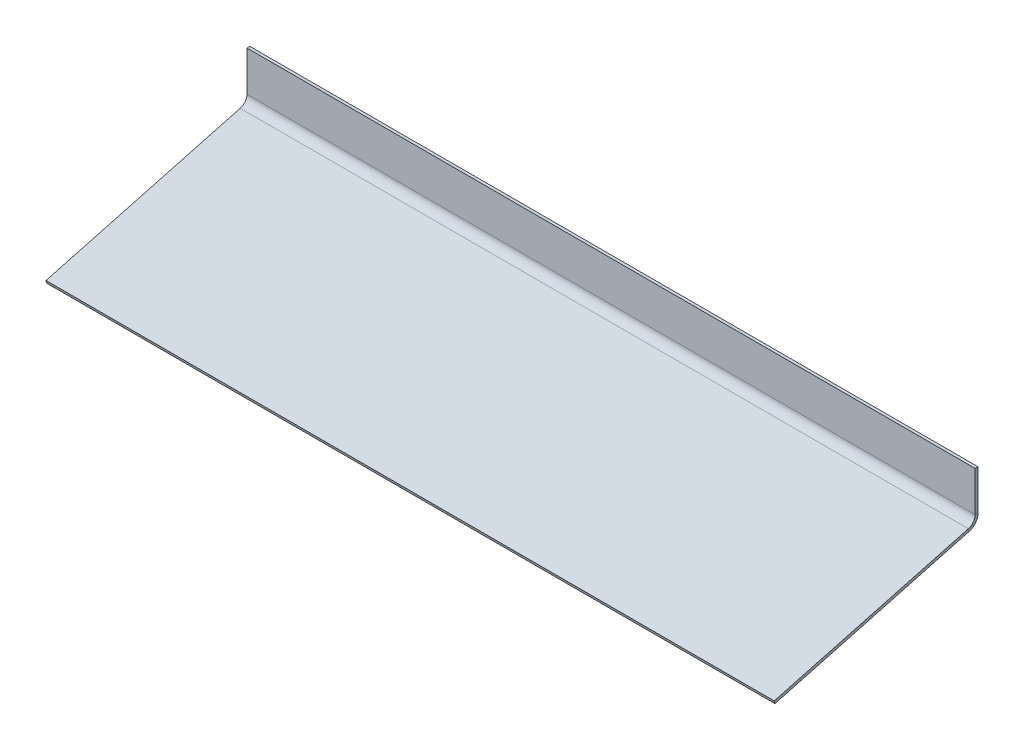
ISO-10303-21;
HEADER;
FILE_DESCRIPTION(('STEP AP214'),'2;1');
FILE_NAME('part.step','',(''),(''),'','','');
FILE_SCHEMA(('AUTOMOTIVE_DESIGN { 1 0 10303 214 1 1 1 1 }'));
ENDSEC;
DATA;
#1=APPLICATION_CONTEXT('core data for automotive mechanical design processes');
#2=APPLICATION_PROTOCOL_DEFINITION('international standard','automotive_design',2000,#1);
#3=PRODUCT_CONTEXT('',#1,'mechanical');
#4=PRODUCT('Part','Part','',(#3));
#5=PRODUCT_RELATED_PRODUCT_CATEGORY('part','',(#4));
#6=PRODUCT_DEFINITION_FORMATION('','',#4);
#7=PRODUCT_DEFINITION_CONTEXT('part definition',#1,'design');
#8=PRODUCT_DEFINITION('design','',#6,#7);
#9=PRODUCT_DEFINITION_SHAPE('','',#8);
#10=(LENGTH_UNIT() NAMED_UNIT(*) SI_UNIT(.MILLI.,.METRE.));
#11=(NAMED_UNIT(*) PLANE_ANGLE_UNIT() SI_UNIT($,.RADIAN.));
#12=(NAMED_UNIT(*) SI_UNIT($,.STERADIAN.) SOLID_ANGLE_UNIT());
#13=UNCERTAINTY_MEASURE_WITH_UNIT(LENGTH_MEASURE(1.E-05),#10,'distance_accuracy_value','');
#14=(GEOMETRIC_REPRESENTATION_CONTEXT(3) GLOBAL_UNCERTAINTY_ASSIGNED_CONTEXT((#13)) GLOBAL_UNIT_ASSIGNED_CONTEXT((#10,
#11,#12)) REPRESENTATION_CONTEXT('',''));
#15=CARTESIAN_POINT('',(0.,0.,0.));
#16=DIRECTION('',(0.,0.,1.));
#17=DIRECTION('',(1.,0.,0.));
#18=AXIS2_PLACEMENT_3D('',#15,#16,#17);
#19=CARTESIAN_POINT('',(203.2,42.9719521339447,56.666738549513));
#20=DIRECTION('',(-1.,0.,0.));
#21=DIRECTION('',(0.,0.258819045102518,-0.965925826289069));
#22=AXIS2_PLACEMENT_3D('',#19,#20,#21);
#23=PLANE('',#22);
#24=DIRECTION('',(0.,0.258819045102518,-0.965925826289069));
#25=VECTOR('',#24,1.);
#26=CARTESIAN_POINT('',(203.2,42.1992105649432,56.459683070141));
#27=LINE('',#26,#25);
#28=CARTESIAN_POINT('',(203.2,42.1992105649432,56.459683070141));
#29=VERTEX_POINT('',#28);
#30=CARTESIAN_POINT('',(203.2,56.7178068322242,2.27554414606768));
#31=VERTEX_POINT('',#30);
#32=EDGE_CURVE('E89',#29,#31,#27,.T.);
#33=ORIENTED_EDGE('',*,*,#32,.T.);
#34=DIRECTION('',(0.,0.965925826289067,0.258819045102525));
#35=VECTOR('',#34,1.);
#36=CARTESIAN_POINT('',(203.2,57.4905484012261,2.4825996254397));
#37=LINE('',#36,#35);
#38=CARTESIAN_POINT('',(203.2,57.4905484012258,2.48259962543961));
#39=VERTEX_POINT('',#38);
#40=EDGE_CURVE('E130',#31,#39,#37,.T.);
#41=ORIENTED_EDGE('',*,*,#40,.T.);
#42=DIRECTION('',(0.,0.258819045102518,-0.965925826289069));
#43=VECTOR('',#42,1.);
#44=CARTESIAN_POINT('',(203.2,42.9719521339447,56.666738549513));
#45=LINE('',#44,#43);
#46=CARTESIAN_POINT('',(203.2,42.9719521339447,56.666738549513));
#47=VERTEX_POINT('',#46);
#48=EDGE_CURVE('E132',#47,#39,#45,.T.);
#49=ORIENTED_EDGE('',*,*,#48,.F.);
#50=DIRECTION('',(0.,0.965925826289069,0.258819045102518));
#51=VECTOR('',#50,1.);
#52=CARTESIAN_POINT('',(203.2,42.9719521339447,56.666738549513));
#53=LINE('',#52,#51);
#54=EDGE_CURVE('E155',#29,#47,#53,.T.);
#55=ORIENTED_EDGE('',*,*,#54,.F.);
#56=EDGE_LOOP('',(#33,#41,#49,#55));
#57=FACE_BOUND('',#56,.T.);
#58=ADVANCED_FACE('F65',(#57),#23,.F.);
#59=CARTESIAN_POINT('',(0.,42.9719521339447,56.666738549513));
#60=DIRECTION('',(1.,0.,0.));
#61=DIRECTION('',(0.,-0.258819045102518,0.965925826289069));
#62=AXIS2_PLACEMENT_3D('',#59,#60,#61);
#63=PLANE('',#62);
#64=DIRECTION('',(0.,-0.258819045102518,0.965925826289069));
#65=VECTOR('',#64,1.);
#66=CARTESIAN_POINT('',(0.,42.9719521339447,56.666738549513));
#67=LINE('',#66,#65);
#68=CARTESIAN_POINT('',(0.,57.4905484012258,2.4825996254396));
#69=VERTEX_POINT('',#68);
#70=CARTESIAN_POINT('',(0.,42.9719521339447,56.666738549513));
#71=VERTEX_POINT('',#70);
#72=EDGE_CURVE('E69',#69,#71,#67,.T.);
#73=ORIENTED_EDGE('',*,*,#72,.F.);
#74=DIRECTION('',(0.,-0.965925826289067,-0.258819045102525));
#75=VECTOR('',#74,1.);
#76=CARTESIAN_POINT('',(0.,57.4905484012261,2.4825996254397));
#77=LINE('',#76,#75);
#78=CARTESIAN_POINT('',(0.,56.7178068322242,2.27554414606768));
#79=VERTEX_POINT('',#78);
#80=EDGE_CURVE('E12',#69,#79,#77,.T.);
#81=ORIENTED_EDGE('',*,*,#80,.T.);
#82=DIRECTION('',(0.,0.258819045102518,-0.965925826289069));
#83=VECTOR('',#82,1.);
#84=CARTESIAN_POINT('',(0.,42.1992105649432,56.459683070141));
#85=LINE('',#84,#83);
#86=CARTESIAN_POINT('',(0.,42.1992105649432,56.459683070141));
#87=VERTEX_POINT('',#86);
#88=EDGE_CURVE('E82',#79,#87,#85,.F.);
#89=ORIENTED_EDGE('',*,*,#88,.T.);
#90=DIRECTION('',(0.,0.965925826289069,0.258819045102518));
#91=VECTOR('',#90,1.);
#92=CARTESIAN_POINT('',(0.,42.9719521339447,56.666738549513));
#93=LINE('',#92,#91);
#94=EDGE_CURVE('E146',#87,#71,#93,.T.);
#95=ORIENTED_EDGE('',*,*,#94,.T.);
#96=EDGE_LOOP('',(#73,#81,#89,#95));
#97=FACE_BOUND('',#96,.T.);
#98=ADVANCED_FACE('F67',(#97),#63,.F.);
#99=CARTESIAN_POINT('',(0.,42.1992105649432,56.459683070141));
#100=DIRECTION('',(0.,-0.965925826289069,-0.258819045102518));
#101=DIRECTION('',(-1.,0.,0.));
#102=AXIS2_PLACEMENT_3D('',#99,#100,#101);
#103=PLANE('',#102);
#104=ORIENTED_EDGE('',*,*,#88,.F.);
#105=DIRECTION('',(1.,0.,0.));
#106=VECTOR('',#105,1.);
#107=CARTESIAN_POINT('',(0.,56.7178068322242,2.27554414606768));
#108=LINE('',#107,#106);
#109=EDGE_CURVE('E74',#79,#31,#108,.T.);
#110=ORIENTED_EDGE('',*,*,#109,.T.);
#111=ORIENTED_EDGE('',*,*,#32,.F.);
#112=DIRECTION('',(-1.,0.,0.));
#113=VECTOR('',#112,1.);
#114=CARTESIAN_POINT('',(0.,42.1992105649432,56.459683070141));
#115=LINE('',#114,#113);
#116=EDGE_CURVE('E199',#87,#29,#115,.F.);
#117=ORIENTED_EDGE('',*,*,#116,.F.);
#118=EDGE_LOOP('',(#104,#110,#111,#117));
#119=FACE_BOUND('',#118,.T.);
#120=ADVANCED_FACE('F212',(#119),#103,.T.);
#121=CARTESIAN_POINT('',(0.,42.9719521339447,56.666738549513));
#122=DIRECTION('',(0.,0.258819045102518,-0.965925826289069));
#123=DIRECTION('',(1.,0.,0.));
#124=AXIS2_PLACEMENT_3D('',#121,#122,#123);
#125=PLANE('',#124);
#126=ORIENTED_EDGE('',*,*,#116,.T.);
#127=ORIENTED_EDGE('',*,*,#54,.T.);
#128=DIRECTION('',(1.,0.,0.));
#129=VECTOR('',#128,1.);
#130=CARTESIAN_POINT('',(0.,42.9719521339447,56.666738549513));
#131=LINE('',#130,#129);
#132=EDGE_CURVE('E145',#71,#47,#131,.T.);
#133=ORIENTED_EDGE('',*,*,#132,.F.);
#134=ORIENTED_EDGE('',*,*,#94,.F.);
#135=EDGE_LOOP('',(#126,#127,#133,#134));
#136=FACE_BOUND('',#135,.T.);
#137=ADVANCED_FACE('F211',(#136),#125,.F.);
#138=CARTESIAN_POINT('',(0.,42.9719521339447,56.666738549513));
#139=DIRECTION('',(0.,-0.965925826289069,-0.258819045102518));
#140=DIRECTION('',(-1.,0.,0.));
#141=AXIS2_PLACEMENT_3D('',#138,#139,#140);
#142=PLANE('',#141);
#143=DIRECTION('',(1.,0.,0.));
#144=VECTOR('',#143,1.);
#145=CARTESIAN_POINT('',(0.,57.4905484012258,2.4825996254396));
#146=LINE('',#145,#144);
#147=EDGE_CURVE('E137',#69,#39,#146,.T.);
#148=ORIENTED_EDGE('',*,*,#147,.F.);
#149=ORIENTED_EDGE('',*,*,#72,.T.);
#150=ORIENTED_EDGE('',*,*,#132,.T.);
#151=ORIENTED_EDGE('',*,*,#48,.T.);
#152=EDGE_LOOP('',(#148,#149,#150,#151));
#153=FACE_BOUND('',#152,.T.);
#154=ADVANCED_FACE('F142',(#153),#142,.F.);
#155=CARTESIAN_POINT('',(0.,71.12,0.6));
#156=DIRECTION('',(0.,-1.,0.));
#157=DIRECTION('',(-1.,0.,0.));
#158=AXIS2_PLACEMENT_3D('',#155,#156,#157);
#159=PLANE('',#158);
#160=DIRECTION('',(0.,0.,1.));
#161=VECTOR('',#160,1.);
#162=CARTESIAN_POINT('',(203.2,71.12,0.6));
#163=LINE('',#162,#161);
#164=CARTESIAN_POINT('',(203.2,71.12,-0.20000094));
#165=VERTEX_POINT('',#164);
#166=CARTESIAN_POINT('',(203.2,71.12,0.6));
#167=VERTEX_POINT('',#166);
#168=EDGE_CURVE('E175',#165,#167,#163,.T.);
#169=ORIENTED_EDGE('',*,*,#168,.F.);
#170=DIRECTION('',(-1.,0.,0.));
#171=VECTOR('',#170,1.);
#172=CARTESIAN_POINT('',(0.,71.12,-0.20000094));
#173=LINE('',#172,#171);
#174=CARTESIAN_POINT('',(0.,71.12,-0.20000094));
#175=VERTEX_POINT('',#174);
#176=EDGE_CURVE('E192',#165,#175,#173,.T.);
#177=ORIENTED_EDGE('',*,*,#176,.T.);
#178=DIRECTION('',(0.,0.,1.));
#179=VECTOR('',#178,1.);
#180=CARTESIAN_POINT('',(0.,71.12,0.6));
#181=LINE('',#180,#179);
#182=CARTESIAN_POINT('',(0.,71.12,0.6));
#183=VERTEX_POINT('',#182);
#184=EDGE_CURVE('E190',#175,#183,#181,.T.);
#185=ORIENTED_EDGE('',*,*,#184,.T.);
#186=DIRECTION('',(-1.,0.,0.));
#187=VECTOR('',#186,1.);
#188=CARTESIAN_POINT('',(0.,71.12,0.6));
#189=LINE('',#188,#187);
#190=EDGE_CURVE('E180',#167,#183,#189,.T.);
#191=ORIENTED_EDGE('',*,*,#190,.F.);
#192=EDGE_LOOP('',(#169,#177,#185,#191));
#193=FACE_BOUND('',#192,.T.);
#194=ADVANCED_FACE('F235',(#193),#159,.F.);
#195=CARTESIAN_POINT('',(0.,0.,0.6));
#196=DIRECTION('',(0.,0.,-1.));
#197=DIRECTION('',(-1.,0.,0.));
#198=AXIS2_PLACEMENT_3D('',#195,#196,#197);
#199=PLANE('',#198);
#200=DIRECTION('',(0.,-1.,0.));
#201=VECTOR('',#200,1.);
#202=CARTESIAN_POINT('',(0.,0.,0.6));
#203=LINE('',#202,#201);
#204=CARTESIAN_POINT('',(0.,59.944,0.6));
#205=VERTEX_POINT('',#204);
#206=EDGE_CURVE('E188',#183,#205,#203,.T.);
#207=ORIENTED_EDGE('',*,*,#206,.T.);
#208=DIRECTION('',(1.,0.,0.));
#209=VECTOR('',#208,1.);
#210=CARTESIAN_POINT('',(0.,59.944,0.6));
#211=LINE('',#210,#209);
#212=CARTESIAN_POINT('',(203.2,59.944,0.600000000000001));
#213=VERTEX_POINT('',#212);
#214=EDGE_CURVE('E185',#205,#213,#211,.T.);
#215=ORIENTED_EDGE('',*,*,#214,.T.);
#216=DIRECTION('',(0.,1.,0.));
#217=VECTOR('',#216,1.);
#218=CARTESIAN_POINT('',(203.2,0.,0.6));
#219=LINE('',#218,#217);
#220=EDGE_CURVE('E183',#213,#167,#219,.T.);
#221=ORIENTED_EDGE('',*,*,#220,.T.);
#222=ORIENTED_EDGE('',*,*,#190,.T.);
#223=EDGE_LOOP('',(#207,#215,#221,#222));
#224=FACE_BOUND('',#223,.T.);
#225=ADVANCED_FACE('F233',(#224),#199,.F.);
#226=CARTESIAN_POINT('',(203.2,0.,0.6));
#227=DIRECTION('',(-1.,0.,0.));
#228=DIRECTION('',(0.,1.,0.));
#229=AXIS2_PLACEMENT_3D('',#226,#227,#228);
#230=PLANE('',#229);
#231=DIRECTION('',(0.,0.,1.));
#232=VECTOR('',#231,1.);
#233=CARTESIAN_POINT('',(203.2,59.944,0.600000000000419));
#234=LINE('',#233,#232);
#235=CARTESIAN_POINT('',(203.2,59.944,-0.20000094));
#236=VERTEX_POINT('',#235);
#237=EDGE_CURVE('E160',#236,#213,#234,.T.);
#238=ORIENTED_EDGE('',*,*,#237,.F.);
#239=DIRECTION('',(0.,1.,0.));
#240=VECTOR('',#239,1.);
#241=CARTESIAN_POINT('',(203.2,0.,-0.20000094));
#242=LINE('',#241,#240);
#243=EDGE_CURVE('E178',#236,#165,#242,.T.);
#244=ORIENTED_EDGE('',*,*,#243,.T.);
#245=ORIENTED_EDGE('',*,*,#168,.T.);
#246=ORIENTED_EDGE('',*,*,#220,.F.);
#247=EDGE_LOOP('',(#238,#244,#245,#246));
#248=FACE_BOUND('',#247,.T.);
#249=ADVANCED_FACE('F230',(#248),#230,.F.);
#250=CARTESIAN_POINT('',(0.,0.,-0.20000094));
#251=DIRECTION('',(0.,0.,-1.));
#252=DIRECTION('',(-1.,0.,0.));
#253=AXIS2_PLACEMENT_3D('',#250,#251,#252);
#254=PLANE('',#253);
#255=DIRECTION('',(1.,0.,0.));
#256=VECTOR('',#255,1.);
#257=CARTESIAN_POINT('',(0.,59.944,-0.20000094));
#258=LINE('',#257,#256);
#259=CARTESIAN_POINT('',(0.,59.944,-0.20000094));
#260=VERTEX_POINT('',#259);
#261=EDGE_CURVE('E164',#260,#236,#258,.T.);
#262=ORIENTED_EDGE('',*,*,#261,.F.);
#263=DIRECTION('',(0.,1.,0.));
#264=VECTOR('',#263,1.);
#265=CARTESIAN_POINT('',(0.,0.,-0.20000094));
#266=LINE('',#265,#264);
#267=EDGE_CURVE('E173',#175,#260,#266,.F.);
#268=ORIENTED_EDGE('',*,*,#267,.F.);
#269=ORIENTED_EDGE('',*,*,#176,.F.);
#270=ORIENTED_EDGE('',*,*,#243,.F.);
#271=EDGE_LOOP('',(#262,#268,#269,#270));
#272=FACE_BOUND('',#271,.T.);
#273=ADVANCED_FACE('F227',(#272),#254,.T.);
#274=CARTESIAN_POINT('',(0.,0.,0.6));
#275=DIRECTION('',(1.,0.,0.));
#276=DIRECTION('',(0.,-1.,0.));
#277=AXIS2_PLACEMENT_3D('',#274,#275,#276);
#278=PLANE('',#277);
#279=DIRECTION('',(0.,0.,-1.));
#280=VECTOR('',#279,1.);
#281=CARTESIAN_POINT('',(0.,59.944,0.600000000000419));
#282=LINE('',#281,#280);
#283=EDGE_CURVE('E161',#205,#260,#282,.T.);
#284=ORIENTED_EDGE('',*,*,#283,.F.);
#285=ORIENTED_EDGE('',*,*,#206,.F.);
#286=ORIENTED_EDGE('',*,*,#184,.F.);
#287=ORIENTED_EDGE('',*,*,#267,.T.);
#288=EDGE_LOOP('',(#284,#285,#286,#287));
#289=FACE_BOUND('',#288,.T.);
#290=ADVANCED_FACE('F222',(#289),#278,.F.);
#291=CARTESIAN_POINT('',(0.,59.944,3.14));
#292=DIRECTION('',(1.,0.,0.));
#293=DIRECTION('',(0.,0.,-1.));
#294=AXIS2_PLACEMENT_3D('',#291,#292,#293);
#295=PLANE('',#294);
#296=ORIENTED_EDGE('',*,*,#283,.T.);
#297=CARTESIAN_POINT('',(0.,59.944,3.14));
#298=DIRECTION('',(1.,0.,0.));
#299=DIRECTION('',(0.,0.,-1.));
#300=AXIS2_PLACEMENT_3D('',#297,#298,#299);
#301=CIRCLE('',#300,3.34000094);
#302=EDGE_CURVE('E170',#260,#79,#301,.F.);
#303=ORIENTED_EDGE('',*,*,#302,.T.);
#304=ORIENTED_EDGE('',*,*,#80,.F.);
#305=CARTESIAN_POINT('',(0.,59.944,3.14));
#306=DIRECTION('',(-1.,0.,0.));
#307=DIRECTION('',(0.,0.,1.));
#308=AXIS2_PLACEMENT_3D('',#305,#306,#307);
#309=CIRCLE('',#308,2.54);
#310=EDGE_CURVE('E154',#205,#69,#309,.T.);
#311=ORIENTED_EDGE('',*,*,#310,.F.);
#312=EDGE_LOOP('',(#296,#303,#304,#311));
#313=FACE_BOUND('',#312,.T.);
#314=ADVANCED_FACE('F218',(#313),#295,.F.);
#315=CARTESIAN_POINT('',(203.2,59.944,3.14));
#316=DIRECTION('',(-1.,0.,0.));
#317=DIRECTION('',(0.,0.,1.));
#318=AXIS2_PLACEMENT_3D('',#315,#316,#317);
#319=PLANE('',#318);
#320=ORIENTED_EDGE('',*,*,#40,.F.);
#321=CARTESIAN_POINT('',(203.2,59.944,3.14));
#322=DIRECTION('',(1.,0.,0.));
#323=DIRECTION('',(0.,0.,-1.));
#324=AXIS2_PLACEMENT_3D('',#321,#322,#323);
#325=CIRCLE('',#324,3.34000094);
#326=EDGE_CURVE('E166',#31,#236,#325,.T.);
#327=ORIENTED_EDGE('',*,*,#326,.T.);
#328=ORIENTED_EDGE('',*,*,#237,.T.);
#329=CARTESIAN_POINT('',(203.2,59.944,3.14));
#330=DIRECTION('',(1.,0.,0.));
#331=DIRECTION('',(0.,0.,-1.));
#332=AXIS2_PLACEMENT_3D('',#329,#330,#331);
#333=CIRCLE('',#332,2.54);
#334=EDGE_CURVE('E152',#39,#213,#333,.T.);
#335=ORIENTED_EDGE('',*,*,#334,.F.);
#336=EDGE_LOOP('',(#320,#327,#328,#335));
#337=FACE_BOUND('',#336,.T.);
#338=ADVANCED_FACE('F158',(#337),#319,.F.);
#339=CARTESIAN_POINT('',(-101.638014606874,59.944,3.14));
#340=DIRECTION('',(1.,0.,0.));
#341=DIRECTION('',(0.,0.,-1.));
#342=AXIS2_PLACEMENT_3D('',#339,#340,#341);
#343=CYLINDRICAL_SURFACE('',#342,2.54);
#344=ORIENTED_EDGE('',*,*,#334,.T.);
#345=ORIENTED_EDGE('',*,*,#214,.F.);
#346=ORIENTED_EDGE('',*,*,#310,.T.);
#347=ORIENTED_EDGE('',*,*,#147,.T.);
#348=EDGE_LOOP('',(#344,#345,#346,#347));
#349=FACE_BOUND('',#348,.T.);
#350=ADVANCED_FACE('F150',(#349),#343,.F.);
#351=CARTESIAN_POINT('',(-101.638014606874,59.944,3.14));
#352=DIRECTION('',(1.,0.,0.));
#353=DIRECTION('',(0.,0.,-1.));
#354=AXIS2_PLACEMENT_3D('',#351,#352,#353);
#355=CYLINDRICAL_SURFACE('',#354,3.34000094);
#356=ORIENTED_EDGE('',*,*,#326,.F.);
#357=ORIENTED_EDGE('',*,*,#109,.F.);
#358=ORIENTED_EDGE('',*,*,#302,.F.);
#359=ORIENTED_EDGE('',*,*,#261,.T.);
#360=EDGE_LOOP('',(#356,#357,#358,#359));
#361=FACE_BOUND('',#360,.T.);
#362=ADVANCED_FACE('F216',(#361),#355,.T.);
#363=CLOSED_SHELL('',(#58,#98,#120,#137,#154,#194,#225,#249,#273,#290,#314,#338,#350,#362));
#364=MANIFOLD_SOLID_BREP('B2',#363);
#365=ADVANCED_BREP_SHAPE_REPRESENTATION('',(#18,#364),#14);
#366=SHAPE_DEFINITION_REPRESENTATION(#9,#365);
ENDSEC;
END-ISO-10303-21;
